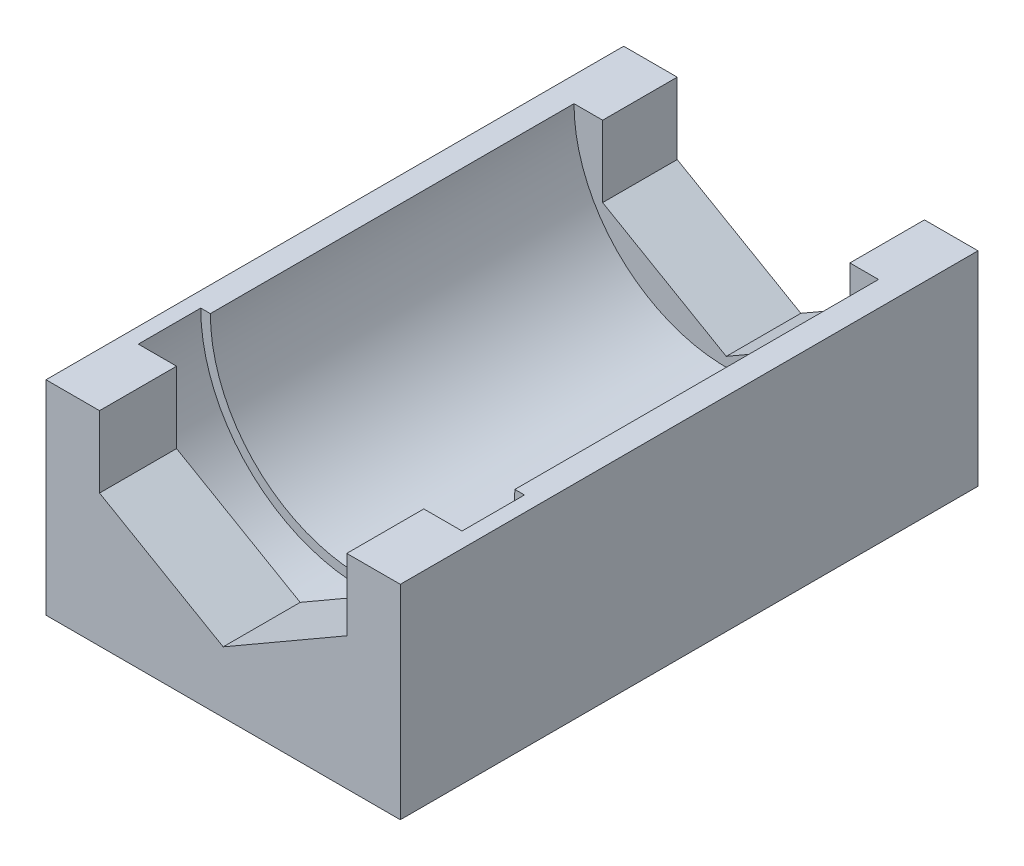
ISO-10303-21;
HEADER;
FILE_DESCRIPTION(('STEP AP214'),'2;1');
FILE_NAME('part.step','',(''),(''),'','','');
FILE_SCHEMA(('AUTOMOTIVE_DESIGN { 1 0 10303 214 1 1 1 1 }'));
ENDSEC;
DATA;
#1=APPLICATION_CONTEXT('core data for automotive mechanical design processes');
#2=APPLICATION_PROTOCOL_DEFINITION('international standard','automotive_design',2000,#1);
#3=PRODUCT_CONTEXT('',#1,'mechanical');
#4=PRODUCT('Part','Part','',(#3));
#5=PRODUCT_RELATED_PRODUCT_CATEGORY('part','',(#4));
#6=PRODUCT_DEFINITION_FORMATION('','',#4);
#7=PRODUCT_DEFINITION_CONTEXT('part definition',#1,'design');
#8=PRODUCT_DEFINITION('design','',#6,#7);
#9=PRODUCT_DEFINITION_SHAPE('','',#8);
#10=(LENGTH_UNIT() NAMED_UNIT(*) SI_UNIT(.MILLI.,.METRE.));
#11=(NAMED_UNIT(*) PLANE_ANGLE_UNIT() SI_UNIT($,.RADIAN.));
#12=(NAMED_UNIT(*) SI_UNIT($,.STERADIAN.) SOLID_ANGLE_UNIT());
#13=UNCERTAINTY_MEASURE_WITH_UNIT(LENGTH_MEASURE(1.E-05),#10,'distance_accuracy_value','');
#14=(GEOMETRIC_REPRESENTATION_CONTEXT(3) GLOBAL_UNCERTAINTY_ASSIGNED_CONTEXT((#13)) GLOBAL_UNIT_ASSIGNED_CONTEXT((#10,
#11,#12)) REPRESENTATION_CONTEXT('',''));
#15=CARTESIAN_POINT('',(0.,0.,0.));
#16=DIRECTION('',(0.,0.,1.));
#17=DIRECTION('',(1.,0.,0.));
#18=AXIS2_PLACEMENT_3D('',#15,#16,#17);
#19=CARTESIAN_POINT('',(0.,0.,0.));
#20=DIRECTION('',(0.,0.,1.));
#21=DIRECTION('',(1.,0.,0.));
#22=AXIS2_PLACEMENT_3D('',#19,#20,#21);
#23=PLANE('',#22);
#24=DIRECTION('',(-1.,0.,0.));
#25=VECTOR('',#24,1.);
#26=CARTESIAN_POINT('',(0.,0.,0.));
#27=LINE('',#26,#25);
#28=CARTESIAN_POINT('',(-12.827,0.,0.));
#29=VERTEX_POINT('',#28);
#30=CARTESIAN_POINT('',(-18.38325,0.,0.));
#31=VERTEX_POINT('',#30);
#32=EDGE_CURVE('E137',#29,#31,#27,.T.);
#33=ORIENTED_EDGE('',*,*,#32,.T.);
#34=DIRECTION('',(0.,-1.,0.));
#35=VECTOR('',#34,1.);
#36=CARTESIAN_POINT('',(-18.38325,0.,0.));
#37=LINE('',#36,#35);
#38=CARTESIAN_POINT('',(-18.38325,-21.1613438057907,0.));
#39=VERTEX_POINT('',#38);
#40=EDGE_CURVE('E140',#31,#39,#37,.T.);
#41=ORIENTED_EDGE('',*,*,#40,.T.);
#42=DIRECTION('',(1.,0.,0.));
#43=VECTOR('',#42,1.);
#44=CARTESIAN_POINT('',(0.,-21.1613438057907,0.));
#45=LINE('',#44,#43);
#46=CARTESIAN_POINT('',(18.38325,-21.1613438057907,0.));
#47=VERTEX_POINT('',#46);
#48=EDGE_CURVE('E144',#39,#47,#45,.T.);
#49=ORIENTED_EDGE('',*,*,#48,.T.);
#50=DIRECTION('',(0.,1.,0.));
#51=VECTOR('',#50,1.);
#52=CARTESIAN_POINT('',(18.38325,0.,0.));
#53=LINE('',#52,#51);
#54=CARTESIAN_POINT('',(18.38325,0.,0.));
#55=VERTEX_POINT('',#54);
#56=EDGE_CURVE('E147',#47,#55,#53,.T.);
#57=ORIENTED_EDGE('',*,*,#56,.T.);
#58=DIRECTION('',(-1.,0.,0.));
#59=VECTOR('',#58,1.);
#60=CARTESIAN_POINT('',(0.,0.,0.));
#61=LINE('',#60,#59);
#62=CARTESIAN_POINT('',(12.827,0.,0.));
#63=VERTEX_POINT('',#62);
#64=EDGE_CURVE('E150',#55,#63,#61,.T.);
#65=ORIENTED_EDGE('',*,*,#64,.T.);
#66=DIRECTION('',(0.,1.,0.));
#67=VECTOR('',#66,1.);
#68=CARTESIAN_POINT('',(12.827,0.,0.));
#69=LINE('',#68,#67);
#70=CARTESIAN_POINT('',(12.827,-7.40567190289533,0.));
#71=VERTEX_POINT('',#70);
#72=EDGE_CURVE('E153',#71,#63,#69,.T.);
#73=ORIENTED_EDGE('',*,*,#72,.F.);
#74=DIRECTION('',(0.866025403784439,0.5,0.));
#75=VECTOR('',#74,1.);
#76=CARTESIAN_POINT('',(6.4135,-11.108507854343,0.));
#77=LINE('',#76,#75);
#78=CARTESIAN_POINT('',(0.,-14.8113438057907,0.));
#79=VERTEX_POINT('',#78);
#80=EDGE_CURVE('E156',#79,#71,#77,.T.);
#81=ORIENTED_EDGE('',*,*,#80,.F.);
#82=DIRECTION('',(0.866025403784439,-0.5,0.));
#83=VECTOR('',#82,1.);
#84=CARTESIAN_POINT('',(-6.41349999999999,-11.108507854343,0.));
#85=LINE('',#84,#83);
#86=CARTESIAN_POINT('',(-12.827,-7.40567190289534,0.));
#87=VERTEX_POINT('',#86);
#88=EDGE_CURVE('E123',#87,#79,#85,.T.);
#89=ORIENTED_EDGE('',*,*,#88,.F.);
#90=DIRECTION('',(0.,-1.,0.));
#91=VECTOR('',#90,1.);
#92=CARTESIAN_POINT('',(-12.827,0.,0.));
#93=LINE('',#92,#91);
#94=EDGE_CURVE('E159',#29,#87,#93,.T.);
#95=ORIENTED_EDGE('',*,*,#94,.F.);
#96=EDGE_LOOP('',(#33,#41,#49,#57,#65,#73,#81,#89,#95));
#97=FACE_BOUND('',#96,.T.);
#98=ADVANCED_FACE('F36',(#97),#23,.T.);
#99=CARTESIAN_POINT('',(6.4135,-11.108507854343,-52.205382));
#100=DIRECTION('',(-0.5,0.866025403784439,0.));
#101=DIRECTION('',(-0.866025403784439,-0.5,0.));
#102=AXIS2_PLACEMENT_3D('',#99,#100,#101);
#103=PLANE('',#102);
#104=DIRECTION('',(0.866025403784439,0.5,0.));
#105=VECTOR('',#104,1.);
#106=CARTESIAN_POINT('',(6.4135,-11.108507854343,-59.944));
#107=LINE('',#106,#105);
#108=CARTESIAN_POINT('',(0.,-14.8113438057907,-59.944));
#109=VERTEX_POINT('',#108);
#110=CARTESIAN_POINT('',(12.827,-7.40567190289533,-59.944));
#111=VERTEX_POINT('',#110);
#112=EDGE_CURVE('E236',#109,#111,#107,.T.);
#113=ORIENTED_EDGE('',*,*,#112,.F.);
#114=DIRECTION('',(0.,0.,-1.));
#115=VECTOR('',#114,1.);
#116=CARTESIAN_POINT('',(0.,-14.8113438057907,-52.205382));
#117=LINE('',#116,#115);
#118=CARTESIAN_POINT('',(0.,-14.8113438057907,-52.205382));
#119=VERTEX_POINT('',#118);
#120=EDGE_CURVE('E220',#119,#109,#117,.T.);
#121=ORIENTED_EDGE('',*,*,#120,.F.);
#122=DIRECTION('',(0.866025403784439,0.5,0.));
#123=VECTOR('',#122,1.);
#124=CARTESIAN_POINT('',(6.4135,-11.108507854343,-52.205382));
#125=LINE('',#124,#123);
#126=CARTESIAN_POINT('',(12.827,-7.40567190289533,-52.205382));
#127=VERTEX_POINT('',#126);
#128=EDGE_CURVE('E259',#119,#127,#125,.T.);
#129=ORIENTED_EDGE('',*,*,#128,.T.);
#130=DIRECTION('',(0.,0.,-1.));
#131=VECTOR('',#130,1.);
#132=CARTESIAN_POINT('',(12.827,-7.40567190289533,-52.205382));
#133=LINE('',#132,#131);
#134=EDGE_CURVE('E217',#127,#111,#133,.T.);
#135=ORIENTED_EDGE('',*,*,#134,.T.);
#136=EDGE_LOOP('',(#113,#121,#129,#135));
#137=FACE_BOUND('',#136,.T.);
#138=ADVANCED_FACE('F341',(#137),#103,.T.);
#139=CARTESIAN_POINT('',(-6.41349999999999,-11.108507854343,-52.205382));
#140=DIRECTION('',(0.499999999999999,0.866025403784439,0.));
#141=DIRECTION('',(-0.866025403784439,0.5,0.));
#142=AXIS2_PLACEMENT_3D('',#139,#140,#141);
#143=PLANE('',#142);
#144=DIRECTION('',(0.866025403784439,-0.5,0.));
#145=VECTOR('',#144,1.);
#146=CARTESIAN_POINT('',(-6.41349999999999,-11.108507854343,-59.944));
#147=LINE('',#146,#145);
#148=CARTESIAN_POINT('',(-12.827,-7.40567190289534,-59.944));
#149=VERTEX_POINT('',#148);
#150=EDGE_CURVE('E233',#149,#109,#147,.T.);
#151=ORIENTED_EDGE('',*,*,#150,.F.);
#152=DIRECTION('',(0.,0.,-1.));
#153=VECTOR('',#152,1.);
#154=CARTESIAN_POINT('',(-12.827,-7.40567190289534,-52.205382));
#155=LINE('',#154,#153);
#156=CARTESIAN_POINT('',(-12.827,-7.40567190289534,-52.205382));
#157=VERTEX_POINT('',#156);
#158=EDGE_CURVE('E223',#157,#149,#155,.T.);
#159=ORIENTED_EDGE('',*,*,#158,.F.);
#160=DIRECTION('',(0.866025403784439,-0.5,0.));
#161=VECTOR('',#160,1.);
#162=CARTESIAN_POINT('',(-6.41349999999999,-11.108507854343,-52.205382));
#163=LINE('',#162,#161);
#164=EDGE_CURVE('E256',#157,#119,#163,.T.);
#165=ORIENTED_EDGE('',*,*,#164,.T.);
#166=ORIENTED_EDGE('',*,*,#120,.T.);
#167=EDGE_LOOP('',(#151,#159,#165,#166));
#168=FACE_BOUND('',#167,.T.);
#169=ADVANCED_FACE('F344',(#168),#143,.T.);
#170=CARTESIAN_POINT('',(-12.827,0.,-52.205382));
#171=DIRECTION('',(1.,0.,0.));
#172=DIRECTION('',(0.,1.,0.));
#173=AXIS2_PLACEMENT_3D('',#170,#171,#172);
#174=PLANE('',#173);
#175=DIRECTION('',(0.,-1.,0.));
#176=VECTOR('',#175,1.);
#177=CARTESIAN_POINT('',(-12.827,0.,-59.944));
#178=LINE('',#177,#176);
#179=CARTESIAN_POINT('',(-12.827,0.,-59.944));
#180=VERTEX_POINT('',#179);
#181=EDGE_CURVE('E229',#180,#149,#178,.T.);
#182=ORIENTED_EDGE('',*,*,#181,.F.);
#183=DIRECTION('',(0.,0.,-1.));
#184=VECTOR('',#183,1.);
#185=CARTESIAN_POINT('',(-12.827,0.,-52.205382));
#186=LINE('',#185,#184);
#187=CARTESIAN_POINT('',(-12.827,0.,-52.205382));
#188=VERTEX_POINT('',#187);
#189=EDGE_CURVE('E226',#188,#180,#186,.T.);
#190=ORIENTED_EDGE('',*,*,#189,.F.);
#191=DIRECTION('',(0.,-1.,0.));
#192=VECTOR('',#191,1.);
#193=CARTESIAN_POINT('',(-12.827,0.,-52.205382));
#194=LINE('',#193,#192);
#195=EDGE_CURVE('E228',#188,#157,#194,.T.);
#196=ORIENTED_EDGE('',*,*,#195,.T.);
#197=ORIENTED_EDGE('',*,*,#158,.T.);
#198=EDGE_LOOP('',(#182,#190,#196,#197));
#199=FACE_BOUND('',#198,.T.);
#200=ADVANCED_FACE('F347',(#199),#174,.T.);
#201=CARTESIAN_POINT('',(-18.38325,0.,-7.992618));
#202=DIRECTION('',(-1.,0.,0.));
#203=DIRECTION('',(0.,0.,1.));
#204=AXIS2_PLACEMENT_3D('',#201,#202,#203);
#205=PLANE('',#204);
#206=ORIENTED_EDGE('',*,*,#40,.F.);
#207=DIRECTION('',(0.,0.,1.));
#208=VECTOR('',#207,1.);
#209=CARTESIAN_POINT('',(-18.38325,0.,-7.992618));
#210=LINE('',#209,#208);
#211=CARTESIAN_POINT('',(-18.38325,0.,-59.944));
#212=VERTEX_POINT('',#211);
#213=EDGE_CURVE('E40',#212,#31,#210,.T.);
#214=ORIENTED_EDGE('',*,*,#213,.F.);
#215=DIRECTION('',(0.,-1.,0.));
#216=VECTOR('',#215,1.);
#217=CARTESIAN_POINT('',(-18.38325,0.,-59.944));
#218=LINE('',#217,#216);
#219=CARTESIAN_POINT('',(-18.38325,-21.1613438057907,-59.944));
#220=VERTEX_POINT('',#219);
#221=EDGE_CURVE('E251',#212,#220,#218,.T.);
#222=ORIENTED_EDGE('',*,*,#221,.T.);
#223=DIRECTION('',(0.,0.,1.));
#224=VECTOR('',#223,1.);
#225=CARTESIAN_POINT('',(-18.38325,-21.1613438057907,-7.992618));
#226=LINE('',#225,#224);
#227=EDGE_CURVE('E169',#220,#39,#226,.T.);
#228=ORIENTED_EDGE('',*,*,#227,.T.);
#229=EDGE_LOOP('',(#206,#214,#222,#228));
#230=FACE_BOUND('',#229,.T.);
#231=ADVANCED_FACE('F182',(#230),#205,.T.);
#232=CARTESIAN_POINT('',(0.,-21.1613438057907,-7.992618));
#233=DIRECTION('',(0.,-1.,0.));
#234=DIRECTION('',(0.,0.,-1.));
#235=AXIS2_PLACEMENT_3D('',#232,#233,#234);
#236=PLANE('',#235);
#237=ORIENTED_EDGE('',*,*,#48,.F.);
#238=ORIENTED_EDGE('',*,*,#227,.F.);
#239=DIRECTION('',(1.,0.,0.));
#240=VECTOR('',#239,1.);
#241=CARTESIAN_POINT('',(0.,-21.1613438057907,-59.944));
#242=LINE('',#241,#240);
#243=CARTESIAN_POINT('',(18.38325,-21.1613438057907,-59.944));
#244=VERTEX_POINT('',#243);
#245=EDGE_CURVE('E248',#220,#244,#242,.T.);
#246=ORIENTED_EDGE('',*,*,#245,.T.);
#247=DIRECTION('',(0.,0.,1.));
#248=VECTOR('',#247,1.);
#249=CARTESIAN_POINT('',(18.38325,-21.1613438057907,-7.992618));
#250=LINE('',#249,#248);
#251=EDGE_CURVE('E168',#244,#47,#250,.T.);
#252=ORIENTED_EDGE('',*,*,#251,.T.);
#253=EDGE_LOOP('',(#237,#238,#246,#252));
#254=FACE_BOUND('',#253,.T.);
#255=ADVANCED_FACE('F353',(#254),#236,.T.);
#256=CARTESIAN_POINT('',(0.,0.,-14.469618));
#257=DIRECTION('',(0.,0.,1.));
#258=DIRECTION('',(1.,0.,0.));
#259=AXIS2_PLACEMENT_3D('',#256,#257,#258);
#260=CYLINDRICAL_SURFACE('',#259,16.79575);
#261=CARTESIAN_POINT('',(0.,0.,-7.992618));
#262=DIRECTION('',(0.,0.,1.));
#263=DIRECTION('',(1.,0.,0.));
#264=AXIS2_PLACEMENT_3D('',#261,#262,#263);
#265=CIRCLE('',#264,16.79575);
#266=CARTESIAN_POINT('',(-16.79575,0.,-7.992618));
#267=VERTEX_POINT('',#266);
#268=CARTESIAN_POINT('',(16.79575,0.,-7.992618));
#269=VERTEX_POINT('',#268);
#270=EDGE_CURVE('E53',#267,#269,#265,.T.);
#271=ORIENTED_EDGE('',*,*,#270,.T.);
#272=DIRECTION('',(0.,0.,1.));
#273=VECTOR('',#272,1.);
#274=CARTESIAN_POINT('',(16.79575,0.,-14.469618));
#275=LINE('',#274,#273);
#276=CARTESIAN_POINT('',(16.79575,0.,-14.469618));
#277=VERTEX_POINT('',#276);
#278=EDGE_CURVE('E189',#277,#269,#275,.T.);
#279=ORIENTED_EDGE('',*,*,#278,.F.);
#280=CARTESIAN_POINT('',(0.,0.,-14.469618));
#281=DIRECTION('',(0.,0.,1.));
#282=DIRECTION('',(1.,0.,0.));
#283=AXIS2_PLACEMENT_3D('',#280,#281,#282);
#284=CIRCLE('',#283,16.79575);
#285=CARTESIAN_POINT('',(-16.79575,0.,-14.469618));
#286=VERTEX_POINT('',#285);
#287=EDGE_CURVE('E191',#286,#277,#284,.T.);
#288=ORIENTED_EDGE('',*,*,#287,.F.);
#289=DIRECTION('',(0.,0.,1.));
#290=VECTOR('',#289,1.);
#291=CARTESIAN_POINT('',(-16.79575,0.,-14.469618));
#292=LINE('',#291,#290);
#293=EDGE_CURVE('E141',#286,#267,#292,.T.);
#294=ORIENTED_EDGE('',*,*,#293,.T.);
#295=EDGE_LOOP('',(#271,#279,#288,#294));
#296=FACE_BOUND('',#295,.T.);
#297=ADVANCED_FACE('F362',(#296),#260,.F.);
#298=CARTESIAN_POINT('',(0.,0.,-14.469618));
#299=DIRECTION('',(0.,0.,1.));
#300=DIRECTION('',(1.,0.,0.));
#301=AXIS2_PLACEMENT_3D('',#298,#299,#300);
#302=PLANE('',#301);
#303=DIRECTION('',(-1.,0.,0.));
#304=VECTOR('',#303,1.);
#305=CARTESIAN_POINT('',(0.,0.,-14.469618));
#306=LINE('',#305,#304);
#307=CARTESIAN_POINT('',(-15.7988,0.,-14.469618));
#308=VERTEX_POINT('',#307);
#309=EDGE_CURVE('E209',#308,#286,#306,.T.);
#310=ORIENTED_EDGE('',*,*,#309,.T.);
#311=ORIENTED_EDGE('',*,*,#287,.T.);
#312=DIRECTION('',(-1.,0.,0.));
#313=VECTOR('',#312,1.);
#314=CARTESIAN_POINT('',(0.,0.,-14.469618));
#315=LINE('',#314,#313);
#316=CARTESIAN_POINT('',(15.7988,0.,-14.469618));
#317=VERTEX_POINT('',#316);
#318=EDGE_CURVE('E206',#277,#317,#315,.T.);
#319=ORIENTED_EDGE('',*,*,#318,.T.);
#320=CARTESIAN_POINT('',(0.,0.,-14.469618));
#321=DIRECTION('',(0.,0.,1.));
#322=DIRECTION('',(1.,0.,0.));
#323=AXIS2_PLACEMENT_3D('',#320,#321,#322);
#324=CIRCLE('',#323,15.7988);
#325=EDGE_CURVE('E201',#308,#317,#324,.T.);
#326=ORIENTED_EDGE('',*,*,#325,.F.);
#327=EDGE_LOOP('',(#310,#311,#319,#326));
#328=FACE_BOUND('',#327,.T.);
#329=ADVANCED_FACE('F292',(#328),#302,.T.);
#330=CARTESIAN_POINT('',(0.,0.,-94.6268151902739));
#331=DIRECTION('',(0.,0.,1.));
#332=DIRECTION('',(1.,0.,0.));
#333=AXIS2_PLACEMENT_3D('',#330,#331,#332);
#334=CYLINDRICAL_SURFACE('',#333,15.7988);
#335=DIRECTION('',(0.,0.,1.));
#336=VECTOR('',#335,1.);
#337=CARTESIAN_POINT('',(15.7988,0.,-94.6268151902739));
#338=LINE('',#337,#336);
#339=CARTESIAN_POINT('',(15.7988,0.,-52.205382));
#340=VERTEX_POINT('',#339);
#341=EDGE_CURVE('E197',#340,#317,#338,.T.);
#342=ORIENTED_EDGE('',*,*,#341,.F.);
#343=CARTESIAN_POINT('',(0.,0.,-52.205382));
#344=DIRECTION('',(0.,0.,1.));
#345=DIRECTION('',(1.,0.,0.));
#346=AXIS2_PLACEMENT_3D('',#343,#344,#345);
#347=CIRCLE('',#346,15.7988);
#348=CARTESIAN_POINT('',(-15.7988,0.,-52.205382));
#349=VERTEX_POINT('',#348);
#350=EDGE_CURVE('E194',#340,#349,#347,.F.);
#351=ORIENTED_EDGE('',*,*,#350,.T.);
#352=DIRECTION('',(0.,0.,1.));
#353=VECTOR('',#352,1.);
#354=CARTESIAN_POINT('',(-15.7988,0.,-94.6268151902739));
#355=LINE('',#354,#353);
#356=EDGE_CURVE('E200',#349,#308,#355,.T.);
#357=ORIENTED_EDGE('',*,*,#356,.T.);
#358=ORIENTED_EDGE('',*,*,#325,.T.);
#359=EDGE_LOOP('',(#342,#351,#357,#358));
#360=FACE_BOUND('',#359,.T.);
#361=ADVANCED_FACE('F285',(#360),#334,.F.);
#362=CARTESIAN_POINT('',(0.,0.,-52.205382));
#363=DIRECTION('',(0.,0.,1.));
#364=DIRECTION('',(1.,0.,0.));
#365=AXIS2_PLACEMENT_3D('',#362,#363,#364);
#366=PLANE('',#365);
#367=ORIENTED_EDGE('',*,*,#350,.F.);
#368=DIRECTION('',(-1.,0.,0.));
#369=VECTOR('',#368,1.);
#370=CARTESIAN_POINT('',(0.,0.,-52.205382));
#371=LINE('',#370,#369);
#372=CARTESIAN_POINT('',(12.827,0.,-52.205382));
#373=VERTEX_POINT('',#372);
#374=EDGE_CURVE('E265',#340,#373,#371,.T.);
#375=ORIENTED_EDGE('',*,*,#374,.T.);
#376=DIRECTION('',(0.,1.,0.));
#377=VECTOR('',#376,1.);
#378=CARTESIAN_POINT('',(12.827,0.,-52.205382));
#379=LINE('',#378,#377);
#380=EDGE_CURVE('E262',#127,#373,#379,.T.);
#381=ORIENTED_EDGE('',*,*,#380,.F.);
#382=ORIENTED_EDGE('',*,*,#128,.F.);
#383=ORIENTED_EDGE('',*,*,#164,.F.);
#384=ORIENTED_EDGE('',*,*,#195,.F.);
#385=DIRECTION('',(-1.,0.,0.));
#386=VECTOR('',#385,1.);
#387=CARTESIAN_POINT('',(0.,0.,-52.205382));
#388=LINE('',#387,#386);
#389=EDGE_CURVE('E232',#188,#349,#388,.T.);
#390=ORIENTED_EDGE('',*,*,#389,.T.);
#391=EDGE_LOOP('',(#367,#375,#381,#382,#383,#384,#390));
#392=FACE_BOUND('',#391,.T.);
#393=ADVANCED_FACE('F274',(#392),#366,.T.);
#394=CARTESIAN_POINT('',(12.827,0.,-52.205382));
#395=DIRECTION('',(-1.,0.,0.));
#396=DIRECTION('',(0.,-1.,0.));
#397=AXIS2_PLACEMENT_3D('',#394,#395,#396);
#398=PLANE('',#397);
#399=DIRECTION('',(0.,1.,0.));
#400=VECTOR('',#399,1.);
#401=CARTESIAN_POINT('',(12.827,0.,-59.944));
#402=LINE('',#401,#400);
#403=CARTESIAN_POINT('',(12.827,0.,-59.944));
#404=VERTEX_POINT('',#403);
#405=EDGE_CURVE('E239',#111,#404,#402,.T.);
#406=ORIENTED_EDGE('',*,*,#405,.F.);
#407=ORIENTED_EDGE('',*,*,#134,.F.);
#408=ORIENTED_EDGE('',*,*,#380,.T.);
#409=DIRECTION('',(0.,0.,-1.));
#410=VECTOR('',#409,1.);
#411=CARTESIAN_POINT('',(12.827,0.,-52.205382));
#412=LINE('',#411,#410);
#413=EDGE_CURVE('E212',#373,#404,#412,.T.);
#414=ORIENTED_EDGE('',*,*,#413,.T.);
#415=EDGE_LOOP('',(#406,#407,#408,#414));
#416=FACE_BOUND('',#415,.T.);
#417=ADVANCED_FACE('F338',(#416),#398,.T.);
#418=CARTESIAN_POINT('',(0.,0.,-59.944));
#419=DIRECTION('',(0.,0.,1.));
#420=DIRECTION('',(1.,0.,0.));
#421=AXIS2_PLACEMENT_3D('',#418,#419,#420);
#422=PLANE('',#421);
#423=DIRECTION('',(-1.,0.,0.));
#424=VECTOR('',#423,1.);
#425=CARTESIAN_POINT('',(0.,0.,-59.944));
#426=LINE('',#425,#424);
#427=EDGE_CURVE('E180',#180,#212,#426,.T.);
#428=ORIENTED_EDGE('',*,*,#427,.F.);
#429=ORIENTED_EDGE('',*,*,#181,.T.);
#430=ORIENTED_EDGE('',*,*,#150,.T.);
#431=ORIENTED_EDGE('',*,*,#112,.T.);
#432=ORIENTED_EDGE('',*,*,#405,.T.);
#433=DIRECTION('',(-1.,0.,0.));
#434=VECTOR('',#433,1.);
#435=CARTESIAN_POINT('',(0.,0.,-59.944));
#436=LINE('',#435,#434);
#437=CARTESIAN_POINT('',(18.38325,0.,-59.944));
#438=VERTEX_POINT('',#437);
#439=EDGE_CURVE('E242',#438,#404,#436,.T.);
#440=ORIENTED_EDGE('',*,*,#439,.F.);
#441=DIRECTION('',(0.,1.,0.));
#442=VECTOR('',#441,1.);
#443=CARTESIAN_POINT('',(18.38325,0.,-59.944));
#444=LINE('',#443,#442);
#445=EDGE_CURVE('E245',#244,#438,#444,.T.);
#446=ORIENTED_EDGE('',*,*,#445,.F.);
#447=ORIENTED_EDGE('',*,*,#245,.F.);
#448=ORIENTED_EDGE('',*,*,#221,.F.);
#449=EDGE_LOOP('',(#428,#429,#430,#431,#432,#440,#446,#447,#448));
#450=FACE_BOUND('',#449,.T.);
#451=ADVANCED_FACE('F349',(#450),#422,.F.);
#452=CARTESIAN_POINT('',(18.38325,0.,-7.992618));
#453=DIRECTION('',(1.,0.,0.));
#454=DIRECTION('',(0.,0.,-1.));
#455=AXIS2_PLACEMENT_3D('',#452,#453,#454);
#456=PLANE('',#455);
#457=ORIENTED_EDGE('',*,*,#56,.F.);
#458=ORIENTED_EDGE('',*,*,#251,.F.);
#459=ORIENTED_EDGE('',*,*,#445,.T.);
#460=DIRECTION('',(0.,0.,1.));
#461=VECTOR('',#460,1.);
#462=CARTESIAN_POINT('',(18.38325,0.,-7.992618));
#463=LINE('',#462,#461);
#464=EDGE_CURVE('E166',#438,#55,#463,.T.);
#465=ORIENTED_EDGE('',*,*,#464,.T.);
#466=EDGE_LOOP('',(#457,#458,#459,#465));
#467=FACE_BOUND('',#466,.T.);
#468=ADVANCED_FACE('F357',(#467),#456,.T.);
#469=CARTESIAN_POINT('',(0.,0.,-7.992618));
#470=DIRECTION('',(0.,1.,0.));
#471=DIRECTION('',(-1.,0.,0.));
#472=AXIS2_PLACEMENT_3D('',#469,#470,#471);
#473=PLANE('',#472);
#474=ORIENTED_EDGE('',*,*,#64,.F.);
#475=ORIENTED_EDGE('',*,*,#464,.F.);
#476=ORIENTED_EDGE('',*,*,#439,.T.);
#477=ORIENTED_EDGE('',*,*,#413,.F.);
#478=ORIENTED_EDGE('',*,*,#374,.F.);
#479=ORIENTED_EDGE('',*,*,#341,.T.);
#480=ORIENTED_EDGE('',*,*,#318,.F.);
#481=ORIENTED_EDGE('',*,*,#278,.T.);
#482=DIRECTION('',(-1.,0.,0.));
#483=VECTOR('',#482,1.);
#484=CARTESIAN_POINT('',(0.,0.,-7.992618));
#485=LINE('',#484,#483);
#486=CARTESIAN_POINT('',(12.827,0.,-7.992618));
#487=VERTEX_POINT('',#486);
#488=EDGE_CURVE('E99',#269,#487,#485,.T.);
#489=ORIENTED_EDGE('',*,*,#488,.T.);
#490=DIRECTION('',(0.,0.,1.));
#491=VECTOR('',#490,1.);
#492=CARTESIAN_POINT('',(12.827,0.,-7.992618));
#493=LINE('',#492,#491);
#494=EDGE_CURVE('E164',#487,#63,#493,.T.);
#495=ORIENTED_EDGE('',*,*,#494,.T.);
#496=EDGE_LOOP('',(#474,#475,#476,#477,#478,#479,#480,#481,#489,#495));
#497=FACE_BOUND('',#496,.T.);
#498=ADVANCED_FACE('F334',(#497),#473,.T.);
#499=CARTESIAN_POINT('',(12.827,0.,-7.992618));
#500=DIRECTION('',(1.,0.,0.));
#501=DIRECTION('',(0.,1.,0.));
#502=AXIS2_PLACEMENT_3D('',#499,#500,#501);
#503=PLANE('',#502);
#504=ORIENTED_EDGE('',*,*,#72,.T.);
#505=ORIENTED_EDGE('',*,*,#494,.F.);
#506=DIRECTION('',(0.,1.,0.));
#507=VECTOR('',#506,1.);
#508=CARTESIAN_POINT('',(12.827,0.,-7.992618));
#509=LINE('',#508,#507);
#510=CARTESIAN_POINT('',(12.827,-7.40567190289533,-7.992618));
#511=VERTEX_POINT('',#510);
#512=EDGE_CURVE('E131',#511,#487,#509,.T.);
#513=ORIENTED_EDGE('',*,*,#512,.F.);
#514=DIRECTION('',(0.,0.,1.));
#515=VECTOR('',#514,1.);
#516=CARTESIAN_POINT('',(12.827,-7.40567190289533,-7.992618));
#517=LINE('',#516,#515);
#518=EDGE_CURVE('E126',#511,#71,#517,.T.);
#519=ORIENTED_EDGE('',*,*,#518,.T.);
#520=EDGE_LOOP('',(#504,#505,#513,#519));
#521=FACE_BOUND('',#520,.T.);
#522=ADVANCED_FACE('F360',(#521),#503,.F.);
#523=CARTESIAN_POINT('',(6.4135,-11.108507854343,-7.992618));
#524=DIRECTION('',(0.5,-0.866025403784439,0.));
#525=DIRECTION('',(0.866025403784439,0.5,0.));
#526=AXIS2_PLACEMENT_3D('',#523,#524,#525);
#527=PLANE('',#526);
#528=ORIENTED_EDGE('',*,*,#80,.T.);
#529=ORIENTED_EDGE('',*,*,#518,.F.);
#530=DIRECTION('',(0.866025403784439,0.5,0.));
#531=VECTOR('',#530,1.);
#532=CARTESIAN_POINT('',(6.4135,-11.108507854343,-7.992618));
#533=LINE('',#532,#531);
#534=CARTESIAN_POINT('',(0.,-14.8113438057907,-7.992618));
#535=VERTEX_POINT('',#534);
#536=EDGE_CURVE('E112',#535,#511,#533,.T.);
#537=ORIENTED_EDGE('',*,*,#536,.F.);
#538=DIRECTION('',(0.,0.,1.));
#539=VECTOR('',#538,1.);
#540=CARTESIAN_POINT('',(0.,-14.8113438057907,-7.992618));
#541=LINE('',#540,#539);
#542=EDGE_CURVE('E120',#535,#79,#541,.T.);
#543=ORIENTED_EDGE('',*,*,#542,.T.);
#544=EDGE_LOOP('',(#528,#529,#537,#543));
#545=FACE_BOUND('',#544,.T.);
#546=ADVANCED_FACE('F128',(#545),#527,.F.);
#547=CARTESIAN_POINT('',(0.,0.,-7.992618));
#548=DIRECTION('',(0.,1.,0.));
#549=DIRECTION('',(-1.,0.,0.));
#550=AXIS2_PLACEMENT_3D('',#547,#548,#549);
#551=PLANE('',#550);
#552=ORIENTED_EDGE('',*,*,#32,.F.);
#553=DIRECTION('',(0.,0.,1.));
#554=VECTOR('',#553,1.);
#555=CARTESIAN_POINT('',(-12.827,0.,-7.992618));
#556=LINE('',#555,#554);
#557=CARTESIAN_POINT('',(-12.827,0.,-7.992618));
#558=VERTEX_POINT('',#557);
#559=EDGE_CURVE('E11',#558,#29,#556,.T.);
#560=ORIENTED_EDGE('',*,*,#559,.F.);
#561=DIRECTION('',(-1.,0.,0.));
#562=VECTOR('',#561,1.);
#563=CARTESIAN_POINT('',(0.,0.,-7.992618));
#564=LINE('',#563,#562);
#565=EDGE_CURVE('E160',#558,#267,#564,.T.);
#566=ORIENTED_EDGE('',*,*,#565,.T.);
#567=ORIENTED_EDGE('',*,*,#293,.F.);
#568=ORIENTED_EDGE('',*,*,#309,.F.);
#569=ORIENTED_EDGE('',*,*,#356,.F.);
#570=ORIENTED_EDGE('',*,*,#389,.F.);
#571=ORIENTED_EDGE('',*,*,#189,.T.);
#572=ORIENTED_EDGE('',*,*,#427,.T.);
#573=ORIENTED_EDGE('',*,*,#213,.T.);
#574=EDGE_LOOP('',(#552,#560,#566,#567,#568,#569,#570,#571,#572,#573));
#575=FACE_BOUND('',#574,.T.);
#576=ADVANCED_FACE('F38',(#575),#551,.T.);
#577=CARTESIAN_POINT('',(0.,0.,-7.992618));
#578=DIRECTION('',(0.,0.,1.));
#579=DIRECTION('',(1.,0.,0.));
#580=AXIS2_PLACEMENT_3D('',#577,#578,#579);
#581=PLANE('',#580);
#582=ORIENTED_EDGE('',*,*,#270,.F.);
#583=ORIENTED_EDGE('',*,*,#565,.F.);
#584=DIRECTION('',(0.,-1.,0.));
#585=VECTOR('',#584,1.);
#586=CARTESIAN_POINT('',(-12.827,0.,-7.992618));
#587=LINE('',#586,#585);
#588=CARTESIAN_POINT('',(-12.827,-7.40567190289534,-7.992618));
#589=VERTEX_POINT('',#588);
#590=EDGE_CURVE('E114',#558,#589,#587,.T.);
#591=ORIENTED_EDGE('',*,*,#590,.T.);
#592=DIRECTION('',(0.866025403784439,-0.5,0.));
#593=VECTOR('',#592,1.);
#594=CARTESIAN_POINT('',(-6.41349999999999,-11.108507854343,-7.992618));
#595=LINE('',#594,#593);
#596=EDGE_CURVE('E108',#589,#535,#595,.T.);
#597=ORIENTED_EDGE('',*,*,#596,.T.);
#598=ORIENTED_EDGE('',*,*,#536,.T.);
#599=ORIENTED_EDGE('',*,*,#512,.T.);
#600=ORIENTED_EDGE('',*,*,#488,.F.);
#601=EDGE_LOOP('',(#582,#583,#591,#597,#598,#599,#600));
#602=FACE_BOUND('',#601,.T.);
#603=ADVANCED_FACE('F110',(#602),#581,.F.);
#604=CARTESIAN_POINT('',(-6.41349999999999,-11.108507854343,-7.992618));
#605=DIRECTION('',(-0.499999999999999,-0.866025403784439,0.));
#606=DIRECTION('',(0.866025403784439,-0.5,0.));
#607=AXIS2_PLACEMENT_3D('',#604,#605,#606);
#608=PLANE('',#607);
#609=ORIENTED_EDGE('',*,*,#88,.T.);
#610=ORIENTED_EDGE('',*,*,#542,.F.);
#611=ORIENTED_EDGE('',*,*,#596,.F.);
#612=DIRECTION('',(0.,0.,1.));
#613=VECTOR('',#612,1.);
#614=CARTESIAN_POINT('',(-12.827,-7.40567190289534,-7.992618));
#615=LINE('',#614,#613);
#616=EDGE_CURVE('E45',#589,#87,#615,.T.);
#617=ORIENTED_EDGE('',*,*,#616,.T.);
#618=EDGE_LOOP('',(#609,#610,#611,#617));
#619=FACE_BOUND('',#618,.T.);
#620=ADVANCED_FACE('F121',(#619),#608,.F.);
#621=CARTESIAN_POINT('',(-12.827,0.,-7.992618));
#622=DIRECTION('',(-1.,0.,0.));
#623=DIRECTION('',(0.,-1.,0.));
#624=AXIS2_PLACEMENT_3D('',#621,#622,#623);
#625=PLANE('',#624);
#626=ORIENTED_EDGE('',*,*,#94,.T.);
#627=ORIENTED_EDGE('',*,*,#616,.F.);
#628=ORIENTED_EDGE('',*,*,#590,.F.);
#629=ORIENTED_EDGE('',*,*,#559,.T.);
#630=EDGE_LOOP('',(#626,#627,#628,#629));
#631=FACE_BOUND('',#630,.T.);
#632=ADVANCED_FACE('F184',(#631),#625,.F.);
#633=CLOSED_SHELL('',(#98,#138,#169,#200,#231,#255,#297,#329,#361,#393,#417,#451,#468,#498,#522,
#546,#576,#603,#620,#632));
#634=MANIFOLD_SOLID_BREP('B2',#633);
#635=ADVANCED_BREP_SHAPE_REPRESENTATION('',(#18,#634),#14);
#636=SHAPE_DEFINITION_REPRESENTATION(#9,#635);
ENDSEC;
END-ISO-10303-21;
